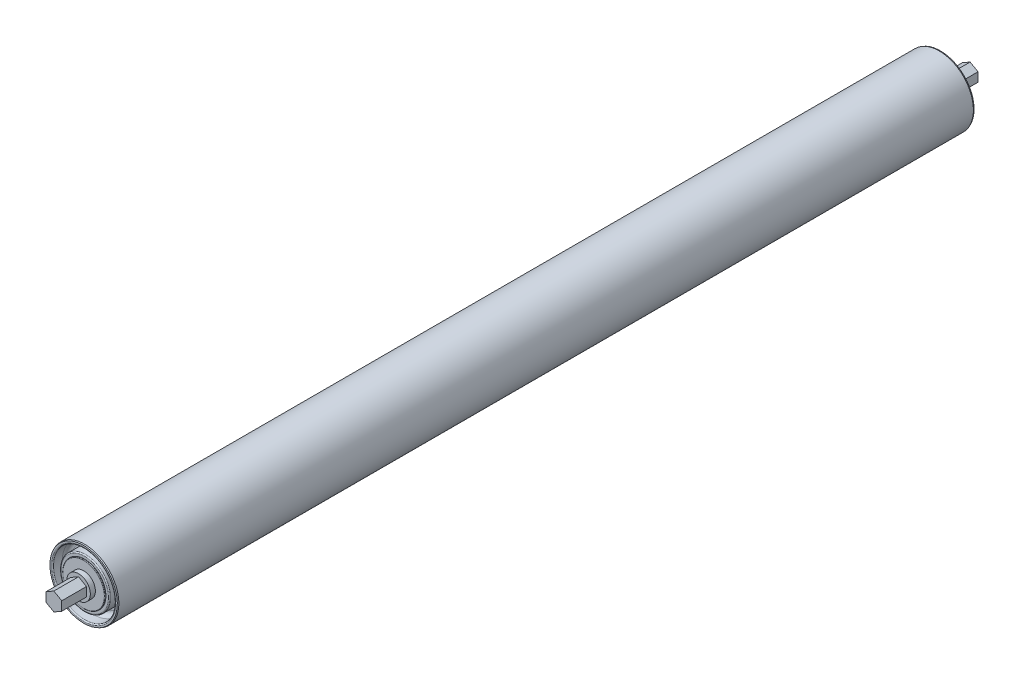
ISO-10303-21;
HEADER;
FILE_DESCRIPTION(('STEP AP214'),'2;1');
FILE_NAME('part.step','',(''),(''),'','','');
FILE_SCHEMA(('AUTOMOTIVE_DESIGN { 1 0 10303 214 1 1 1 1 }'));
ENDSEC;
DATA;
#1=APPLICATION_CONTEXT('core data for automotive mechanical design processes');
#2=APPLICATION_PROTOCOL_DEFINITION('international standard','automotive_design',2000,#1);
#3=PRODUCT_CONTEXT('',#1,'mechanical');
#4=PRODUCT('Part','Part','',(#3));
#5=PRODUCT_RELATED_PRODUCT_CATEGORY('part','',(#4));
#6=PRODUCT_DEFINITION_FORMATION('','',#4);
#7=PRODUCT_DEFINITION_CONTEXT('part definition',#1,'design');
#8=PRODUCT_DEFINITION('design','',#6,#7);
#9=PRODUCT_DEFINITION_SHAPE('','',#8);
#10=(LENGTH_UNIT() NAMED_UNIT(*) SI_UNIT(.MILLI.,.METRE.));
#11=(NAMED_UNIT(*) PLANE_ANGLE_UNIT() SI_UNIT($,.RADIAN.));
#12=(NAMED_UNIT(*) SI_UNIT($,.STERADIAN.) SOLID_ANGLE_UNIT());
#13=UNCERTAINTY_MEASURE_WITH_UNIT(LENGTH_MEASURE(1.E-05),#10,'distance_accuracy_value','');
#14=(GEOMETRIC_REPRESENTATION_CONTEXT(3) GLOBAL_UNCERTAINTY_ASSIGNED_CONTEXT((#13)) GLOBAL_UNIT_ASSIGNED_CONTEXT((#10,
#11,#12)) REPRESENTATION_CONTEXT('',''));
#15=CARTESIAN_POINT('',(0.,0.,0.));
#16=DIRECTION('',(0.,0.,1.));
#17=DIRECTION('',(1.,0.,0.));
#18=AXIS2_PLACEMENT_3D('',#15,#16,#17);
#19=CARTESIAN_POINT('',(0.,23.8125000000001,-302.815625));
#20=DIRECTION('',(0.,0.,1.));
#21=DIRECTION('',(0.,-1.,0.));
#22=AXIS2_PLACEMENT_3D('',#19,#20,#21);
#23=PLANE('',#22);
#24=CARTESIAN_POINT('',(0.,0.,-302.815625));
#25=DIRECTION('',(0.,0.,1.));
#26=DIRECTION('',(0.,-1.,0.));
#27=AXIS2_PLACEMENT_3D('',#24,#25,#26);
#28=CIRCLE('',#27,22.733);
#29=CARTESIAN_POINT('',(0.,-22.733,-302.815625));
#30=VERTEX_POINT('',#29);
#31=EDGE_CURVE('E299',#30,#30,#28,.T.);
#32=ORIENTED_EDGE('',*,*,#31,.T.);
#33=EDGE_LOOP('',(#32));
#34=FACE_BOUND('',#33,.T.);
#35=CARTESIAN_POINT('',(0.,0.,-302.815625));
#36=DIRECTION('',(0.,0.,1.));
#37=DIRECTION('',(0.,-1.,0.));
#38=AXIS2_PLACEMENT_3D('',#35,#36,#37);
#39=CIRCLE('',#38,23.8125);
#40=CARTESIAN_POINT('',(0.,-23.8124999999999,-302.815625));
#41=VERTEX_POINT('',#40);
#42=EDGE_CURVE('E217',#41,#41,#39,.T.);
#43=ORIENTED_EDGE('',*,*,#42,.F.);
#44=EDGE_LOOP('',(#43));
#45=FACE_BOUND('',#44,.T.);
#46=ADVANCED_FACE('F35',(#34,#45),#23,.F.);
#47=CARTESIAN_POINT('',(0.,0.,-302.815625));
#48=DIRECTION('',(0.,0.,1.));
#49=DIRECTION('',(0.,-1.,0.));
#50=AXIS2_PLACEMENT_3D('',#47,#48,#49);
#51=CONICAL_SURFACE('',#50,23.8125,0.380506377112347);
#52=CARTESIAN_POINT('',(0.,0.,-302.021875));
#53=DIRECTION('',(0.,0.,1.));
#54=DIRECTION('',(0.,-1.,0.));
#55=AXIS2_PLACEMENT_3D('',#52,#53,#54);
#56=CIRCLE('',#55,24.13);
#57=CARTESIAN_POINT('',(0.,-24.1299999999999,-302.021875));
#58=VERTEX_POINT('',#57);
#59=EDGE_CURVE('E214',#58,#58,#56,.T.);
#60=ORIENTED_EDGE('',*,*,#59,.F.);
#61=EDGE_LOOP('',(#60));
#62=FACE_BOUND('',#61,.T.);
#63=ORIENTED_EDGE('',*,*,#42,.T.);
#64=EDGE_LOOP('',(#63));
#65=FACE_BOUND('',#64,.T.);
#66=ADVANCED_FACE('F385',(#62,#65),#51,.T.);
#67=CARTESIAN_POINT('',(0.,0.,323.85));
#68=DIRECTION('',(0.,0.,1.));
#69=DIRECTION('',(0.,-1.,0.));
#70=AXIS2_PLACEMENT_3D('',#67,#68,#69);
#71=CYLINDRICAL_SURFACE('',#70,24.13);
#72=CARTESIAN_POINT('',(0.,0.,302.021875));
#73=DIRECTION('',(0.,0.,1.));
#74=DIRECTION('',(0.,-1.,0.));
#75=AXIS2_PLACEMENT_3D('',#72,#73,#74);
#76=CIRCLE('',#75,24.13);
#77=CARTESIAN_POINT('',(0.,-24.13,302.021875));
#78=VERTEX_POINT('',#77);
#79=EDGE_CURVE('E211',#78,#78,#76,.T.);
#80=ORIENTED_EDGE('',*,*,#79,.F.);
#81=EDGE_LOOP('',(#80));
#82=FACE_BOUND('',#81,.T.);
#83=ORIENTED_EDGE('',*,*,#59,.T.);
#84=EDGE_LOOP('',(#83));
#85=FACE_BOUND('',#84,.T.);
#86=ADVANCED_FACE('F390',(#82,#85),#71,.T.);
#87=CARTESIAN_POINT('',(0.,0.,302.021875));
#88=DIRECTION('',(0.,0.,-1.));
#89=DIRECTION('',(0.,1.,0.));
#90=AXIS2_PLACEMENT_3D('',#87,#88,#89);
#91=CONICAL_SURFACE('',#90,24.13,0.380506377112371);
#92=CARTESIAN_POINT('',(0.,0.,302.815625));
#93=DIRECTION('',(0.,0.,1.));
#94=DIRECTION('',(0.,-1.,0.));
#95=AXIS2_PLACEMENT_3D('',#92,#93,#94);
#96=CIRCLE('',#95,23.8125);
#97=CARTESIAN_POINT('',(0.,-23.8125,302.815625));
#98=VERTEX_POINT('',#97);
#99=EDGE_CURVE('E208',#98,#98,#96,.T.);
#100=ORIENTED_EDGE('',*,*,#99,.F.);
#101=EDGE_LOOP('',(#100));
#102=FACE_BOUND('',#101,.T.);
#103=ORIENTED_EDGE('',*,*,#79,.T.);
#104=EDGE_LOOP('',(#103));
#105=FACE_BOUND('',#104,.T.);
#106=ADVANCED_FACE('F469',(#102,#105),#91,.T.);
#107=CARTESIAN_POINT('',(0.,23.8125,302.815625));
#108=DIRECTION('',(0.,0.,-1.));
#109=DIRECTION('',(0.,1.,0.));
#110=AXIS2_PLACEMENT_3D('',#107,#108,#109);
#111=PLANE('',#110);
#112=CARTESIAN_POINT('',(0.,0.,302.815625));
#113=DIRECTION('',(0.,0.,1.));
#114=DIRECTION('',(0.,-1.,0.));
#115=AXIS2_PLACEMENT_3D('',#112,#113,#114);
#116=CIRCLE('',#115,22.733);
#117=CARTESIAN_POINT('',(0.,-22.733,302.815625));
#118=VERTEX_POINT('',#117);
#119=EDGE_CURVE('E134',#118,#118,#116,.T.);
#120=ORIENTED_EDGE('',*,*,#119,.F.);
#121=EDGE_LOOP('',(#120));
#122=FACE_BOUND('',#121,.T.);
#123=ORIENTED_EDGE('',*,*,#99,.T.);
#124=EDGE_LOOP('',(#123));
#125=FACE_BOUND('',#124,.T.);
#126=ADVANCED_FACE('F406',(#122,#125),#111,.F.);
#127=CARTESIAN_POINT('',(0.,0.,302.053625));
#128=DIRECTION('',(0.,0.,1.));
#129=DIRECTION('',(0.,-1.,0.));
#130=AXIS2_PLACEMENT_3D('',#127,#128,#129);
#131=TOROIDAL_SURFACE('',#130,22.733,0.76200000000003);
#132=ORIENTED_EDGE('',*,*,#119,.T.);
#133=EDGE_LOOP('',(#132));
#134=FACE_BOUND('',#133,.T.);
#135=CARTESIAN_POINT('',(0.,0.,302.053625));
#136=DIRECTION('',(0.,0.,1.));
#137=DIRECTION('',(0.,-1.,0.));
#138=AXIS2_PLACEMENT_3D('',#135,#136,#137);
#139=CIRCLE('',#138,21.971);
#140=CARTESIAN_POINT('',(0.,-21.971,302.053625));
#141=VERTEX_POINT('',#140);
#142=EDGE_CURVE('E296',#141,#141,#139,.T.);
#143=ORIENTED_EDGE('',*,*,#142,.F.);
#144=EDGE_LOOP('',(#143));
#145=FACE_BOUND('',#144,.T.);
#146=ADVANCED_FACE('F439',(#134,#145),#131,.T.);
#147=CARTESIAN_POINT('',(0.,0.,302.434625));
#148=DIRECTION('',(0.,0.,1.));
#149=DIRECTION('',(0.,-1.,0.));
#150=AXIS2_PLACEMENT_3D('',#147,#148,#149);
#151=TOROIDAL_SURFACE('',#150,14.620875,0.380999999999973);
#152=CARTESIAN_POINT('',(0.,0.,302.434625));
#153=DIRECTION('',(0.,0.,1.));
#154=DIRECTION('',(0.,-1.,0.));
#155=AXIS2_PLACEMENT_3D('',#152,#153,#154);
#156=CIRCLE('',#155,15.001875);
#157=CARTESIAN_POINT('',(0.,-15.001875,302.434625));
#158=VERTEX_POINT('',#157);
#159=EDGE_CURVE('E275',#158,#158,#156,.T.);
#160=ORIENTED_EDGE('',*,*,#159,.T.);
#161=EDGE_LOOP('',(#160));
#162=FACE_BOUND('',#161,.T.);
#163=CARTESIAN_POINT('',(0.,0.,302.815625));
#164=DIRECTION('',(0.,0.,1.));
#165=DIRECTION('',(0.,-1.,0.));
#166=AXIS2_PLACEMENT_3D('',#163,#164,#165);
#167=CIRCLE('',#166,14.620875);
#168=CARTESIAN_POINT('',(0.,-14.620875,302.815625));
#169=VERTEX_POINT('',#168);
#170=EDGE_CURVE('E272',#169,#169,#167,.T.);
#171=ORIENTED_EDGE('',*,*,#170,.F.);
#172=EDGE_LOOP('',(#171));
#173=FACE_BOUND('',#172,.T.);
#174=ADVANCED_FACE('F435',(#162,#173),#151,.T.);
#175=CARTESIAN_POINT('',(0.,0.,323.85));
#176=DIRECTION('',(0.,0.,1.));
#177=DIRECTION('',(0.,-1.,0.));
#178=AXIS2_PLACEMENT_3D('',#175,#176,#177);
#179=CYLINDRICAL_SURFACE('',#178,15.001875);
#180=CARTESIAN_POINT('',(0.,0.,302.053625));
#181=DIRECTION('',(0.,0.,1.));
#182=DIRECTION('',(0.,-1.,0.));
#183=AXIS2_PLACEMENT_3D('',#180,#181,#182);
#184=CIRCLE('',#183,15.001875);
#185=CARTESIAN_POINT('',(0.,-15.001875,302.053625));
#186=VERTEX_POINT('',#185);
#187=EDGE_CURVE('E278',#186,#186,#184,.T.);
#188=ORIENTED_EDGE('',*,*,#187,.T.);
#189=EDGE_LOOP('',(#188));
#190=FACE_BOUND('',#189,.T.);
#191=ORIENTED_EDGE('',*,*,#159,.F.);
#192=EDGE_LOOP('',(#191));
#193=FACE_BOUND('',#192,.T.);
#194=ADVANCED_FACE('F431',(#190,#193),#179,.T.);
#195=CARTESIAN_POINT('',(0.,15.001875,302.053625));
#196=DIRECTION('',(0.,0.,1.));
#197=DIRECTION('',(0.,-1.,0.));
#198=AXIS2_PLACEMENT_3D('',#195,#196,#197);
#199=PLANE('',#198);
#200=CARTESIAN_POINT('',(0.,0.,302.053625));
#201=DIRECTION('',(0.,0.,1.));
#202=DIRECTION('',(0.,-1.,0.));
#203=AXIS2_PLACEMENT_3D('',#200,#201,#202);
#204=CIRCLE('',#203,16.7401875);
#205=CARTESIAN_POINT('',(0.,-16.7401875,302.053625));
#206=VERTEX_POINT('',#205);
#207=EDGE_CURVE('E281',#206,#206,#204,.T.);
#208=ORIENTED_EDGE('',*,*,#207,.T.);
#209=EDGE_LOOP('',(#208));
#210=FACE_BOUND('',#209,.T.);
#211=ORIENTED_EDGE('',*,*,#187,.F.);
#212=EDGE_LOOP('',(#211));
#213=FACE_BOUND('',#212,.T.);
#214=ADVANCED_FACE('F427',(#210,#213),#199,.T.);
#215=CARTESIAN_POINT('',(0.,0.,301.291625));
#216=DIRECTION('',(0.,0.,1.));
#217=DIRECTION('',(0.,-1.,0.));
#218=AXIS2_PLACEMENT_3D('',#215,#216,#217);
#219=TOROIDAL_SURFACE('',#218,16.7401875,0.76199999999999);
#220=CARTESIAN_POINT('',(0.,0.,301.291625));
#221=DIRECTION('',(0.,0.,1.));
#222=DIRECTION('',(0.,-1.,0.));
#223=AXIS2_PLACEMENT_3D('',#220,#221,#222);
#224=CIRCLE('',#223,17.5021875);
#225=CARTESIAN_POINT('',(0.,-17.5021875,301.291625));
#226=VERTEX_POINT('',#225);
#227=EDGE_CURVE('E284',#226,#226,#224,.T.);
#228=ORIENTED_EDGE('',*,*,#227,.T.);
#229=EDGE_LOOP('',(#228));
#230=FACE_BOUND('',#229,.T.);
#231=ORIENTED_EDGE('',*,*,#207,.F.);
#232=EDGE_LOOP('',(#231));
#233=FACE_BOUND('',#232,.T.);
#234=ADVANCED_FACE('F423',(#230,#233),#219,.T.);
#235=CARTESIAN_POINT('',(0.,0.,323.85));
#236=DIRECTION('',(0.,0.,1.));
#237=DIRECTION('',(0.,-1.,0.));
#238=AXIS2_PLACEMENT_3D('',#235,#236,#237);
#239=CYLINDRICAL_SURFACE('',#238,17.5021875);
#240=CARTESIAN_POINT('',(0.,0.,292.89375));
#241=DIRECTION('',(0.,0.,1.));
#242=DIRECTION('',(0.,-1.,0.));
#243=AXIS2_PLACEMENT_3D('',#240,#241,#242);
#244=CIRCLE('',#243,17.5021875);
#245=CARTESIAN_POINT('',(0.,-17.5021875,292.89375));
#246=VERTEX_POINT('',#245);
#247=EDGE_CURVE('E287',#246,#246,#244,.T.);
#248=ORIENTED_EDGE('',*,*,#247,.T.);
#249=EDGE_LOOP('',(#248));
#250=FACE_BOUND('',#249,.T.);
#251=ORIENTED_EDGE('',*,*,#227,.F.);
#252=EDGE_LOOP('',(#251));
#253=FACE_BOUND('',#252,.T.);
#254=ADVANCED_FACE('F419',(#250,#253),#239,.T.);
#255=CARTESIAN_POINT('',(0.,17.5021875,292.89375));
#256=DIRECTION('',(0.,0.,1.));
#257=DIRECTION('',(0.,-1.,0.));
#258=AXIS2_PLACEMENT_3D('',#255,#256,#257);
#259=PLANE('',#258);
#260=CARTESIAN_POINT('',(0.,0.,292.89375));
#261=DIRECTION('',(0.,0.,1.));
#262=DIRECTION('',(0.,-1.,0.));
#263=AXIS2_PLACEMENT_3D('',#260,#261,#262);
#264=CIRCLE('',#263,18.923);
#265=CARTESIAN_POINT('',(0.,-18.923,292.89375));
#266=VERTEX_POINT('',#265);
#267=EDGE_CURVE('E290',#266,#266,#264,.T.);
#268=ORIENTED_EDGE('',*,*,#267,.T.);
#269=EDGE_LOOP('',(#268));
#270=FACE_BOUND('',#269,.T.);
#271=ORIENTED_EDGE('',*,*,#247,.F.);
#272=EDGE_LOOP('',(#271));
#273=FACE_BOUND('',#272,.T.);
#274=ADVANCED_FACE('F415',(#270,#273),#259,.T.);
#275=CARTESIAN_POINT('',(0.,0.,295.94175));
#276=DIRECTION('',(0.,0.,1.));
#277=DIRECTION('',(0.,-1.,0.));
#278=AXIS2_PLACEMENT_3D('',#275,#276,#277);
#279=TOROIDAL_SURFACE('',#278,18.923,3.048);
#280=CARTESIAN_POINT('',(0.,0.,295.94175));
#281=DIRECTION('',(0.,0.,1.));
#282=DIRECTION('',(0.,-1.,0.));
#283=AXIS2_PLACEMENT_3D('',#280,#281,#282);
#284=CIRCLE('',#283,21.971);
#285=CARTESIAN_POINT('',(0.,-21.971,295.94175));
#286=VERTEX_POINT('',#285);
#287=EDGE_CURVE('E293',#286,#286,#284,.T.);
#288=ORIENTED_EDGE('',*,*,#287,.T.);
#289=EDGE_LOOP('',(#288));
#290=FACE_BOUND('',#289,.T.);
#291=ORIENTED_EDGE('',*,*,#267,.F.);
#292=EDGE_LOOP('',(#291));
#293=FACE_BOUND('',#292,.T.);
#294=ADVANCED_FACE('F411',(#290,#293),#279,.F.);
#295=CARTESIAN_POINT('',(0.,0.,323.85));
#296=DIRECTION('',(0.,0.,1.));
#297=DIRECTION('',(0.,-1.,0.));
#298=AXIS2_PLACEMENT_3D('',#295,#296,#297);
#299=CYLINDRICAL_SURFACE('',#298,21.971);
#300=ORIENTED_EDGE('',*,*,#142,.T.);
#301=EDGE_LOOP('',(#300));
#302=FACE_BOUND('',#301,.T.);
#303=ORIENTED_EDGE('',*,*,#287,.F.);
#304=EDGE_LOOP('',(#303));
#305=FACE_BOUND('',#304,.T.);
#306=ADVANCED_FACE('F408',(#302,#305),#299,.F.);
#307=CARTESIAN_POINT('',(0.,0.,323.85));
#308=DIRECTION('',(0.,0.,-1.));
#309=DIRECTION('',(0.,1.,0.));
#310=AXIS2_PLACEMENT_3D('',#307,#308,#309);
#311=PLANE('',#310);
#312=DIRECTION('',(0.866025403784439,0.5,0.));
#313=VECTOR('',#312,1.);
#314=CARTESIAN_POINT('',(0.,-6.41580486636976,323.85));
#315=LINE('',#314,#313);
#316=CARTESIAN_POINT('',(0.,-6.41580486636976,323.85));
#317=VERTEX_POINT('',#316);
#318=CARTESIAN_POINT('',(5.55625,-3.2079024331849,323.85));
#319=VERTEX_POINT('',#318);
#320=EDGE_CURVE('E154',#317,#319,#315,.T.);
#321=ORIENTED_EDGE('',*,*,#320,.T.);
#322=DIRECTION('',(0.,1.,0.));
#323=VECTOR('',#322,1.);
#324=CARTESIAN_POINT('',(5.55625,-3.2079024331849,323.85));
#325=LINE('',#324,#323);
#326=CARTESIAN_POINT('',(5.55625,3.20790243318482,323.85));
#327=VERTEX_POINT('',#326);
#328=EDGE_CURVE('E130',#319,#327,#325,.T.);
#329=ORIENTED_EDGE('',*,*,#328,.T.);
#330=DIRECTION('',(-0.866025403784439,0.5,0.));
#331=VECTOR('',#330,1.);
#332=CARTESIAN_POINT('',(5.55625,3.20790243318482,323.85));
#333=LINE('',#332,#331);
#334=CARTESIAN_POINT('',(0.,6.41580486636967,323.85));
#335=VERTEX_POINT('',#334);
#336=EDGE_CURVE('E123',#327,#335,#333,.T.);
#337=ORIENTED_EDGE('',*,*,#336,.T.);
#338=DIRECTION('',(-0.866025403784439,-0.5,0.));
#339=VECTOR('',#338,1.);
#340=CARTESIAN_POINT('',(0.,6.41580486636967,323.85));
#341=LINE('',#340,#339);
#342=CARTESIAN_POINT('',(-5.55625,3.20790243318482,323.85));
#343=VERTEX_POINT('',#342);
#344=EDGE_CURVE('E127',#335,#343,#341,.T.);
#345=ORIENTED_EDGE('',*,*,#344,.T.);
#346=DIRECTION('',(0.,-1.,0.));
#347=VECTOR('',#346,1.);
#348=CARTESIAN_POINT('',(-5.55625,3.20790243318482,323.85));
#349=LINE('',#348,#347);
#350=CARTESIAN_POINT('',(-5.55625,-3.2079024331849,323.85));
#351=VERTEX_POINT('',#350);
#352=EDGE_CURVE('E147',#343,#351,#349,.T.);
#353=ORIENTED_EDGE('',*,*,#352,.T.);
#354=DIRECTION('',(0.866025403784439,-0.5,0.));
#355=VECTOR('',#354,1.);
#356=CARTESIAN_POINT('',(-5.55625,-3.2079024331849,323.85));
#357=LINE('',#356,#355);
#358=EDGE_CURVE('E149',#351,#317,#357,.T.);
#359=ORIENTED_EDGE('',*,*,#358,.T.);
#360=EDGE_LOOP('',(#321,#329,#337,#345,#353,#359));
#361=FACE_BOUND('',#360,.T.);
#362=ADVANCED_FACE('F125',(#361),#311,.F.);
#363=CARTESIAN_POINT('',(-5.55625,3.20790243318482,-340.824624136732));
#364=DIRECTION('',(-1.,0.,0.));
#365=DIRECTION('',(0.,-1.,0.));
#366=AXIS2_PLACEMENT_3D('',#363,#364,#365);
#367=PLANE('',#366);
#368=DIRECTION('',(0.,1.,0.));
#369=VECTOR('',#368,1.);
#370=CARTESIAN_POINT('',(-5.55625,8.334375,306.3875));
#371=LINE('',#370,#369);
#372=CARTESIAN_POINT('',(-5.55625,-3.2079024331849,306.3875));
#373=VERTEX_POINT('',#372);
#374=CARTESIAN_POINT('',(-5.55625,3.20790243318482,306.3875));
#375=VERTEX_POINT('',#374);
#376=EDGE_CURVE('E183',#373,#375,#371,.T.);
#377=ORIENTED_EDGE('',*,*,#376,.F.);
#378=DIRECTION('',(0.,0.,1.));
#379=VECTOR('',#378,1.);
#380=CARTESIAN_POINT('',(-5.55625,-3.2079024331849,-340.824624136732));
#381=LINE('',#380,#379);
#382=EDGE_CURVE('E173',#373,#351,#381,.T.);
#383=ORIENTED_EDGE('',*,*,#382,.T.);
#384=ORIENTED_EDGE('',*,*,#352,.F.);
#385=DIRECTION('',(0.,0.,1.));
#386=VECTOR('',#385,1.);
#387=CARTESIAN_POINT('',(-5.55625,3.20790243318482,-340.824624136732));
#388=LINE('',#387,#386);
#389=EDGE_CURVE('E145',#375,#343,#388,.T.);
#390=ORIENTED_EDGE('',*,*,#389,.F.);
#391=EDGE_LOOP('',(#377,#383,#384,#390));
#392=FACE_BOUND('',#391,.T.);
#393=ADVANCED_FACE('F455',(#392),#367,.T.);
#394=CARTESIAN_POINT('',(-5.55625,-3.2079024331849,-340.824624136732));
#395=DIRECTION('',(-0.5,-0.866025403784439,0.));
#396=DIRECTION('',(0.866025403784439,-0.5,0.));
#397=AXIS2_PLACEMENT_3D('',#394,#395,#396);
#398=PLANE('',#397);
#399=DIRECTION('',(-0.866025403784439,0.5,0.));
#400=VECTOR('',#399,1.);
#401=CARTESIAN_POINT('',(-6.38701523733298,-2.72825989977732,306.3875));
#402=LINE('',#401,#400);
#403=CARTESIAN_POINT('',(0.,-6.41580486636976,306.3875));
#404=VERTEX_POINT('',#403);
#405=EDGE_CURVE('E187',#404,#373,#402,.T.);
#406=ORIENTED_EDGE('',*,*,#405,.F.);
#407=DIRECTION('',(0.,0.,1.));
#408=VECTOR('',#407,1.);
#409=CARTESIAN_POINT('',(0.,-6.41580486636976,-340.824624136732));
#410=LINE('',#409,#408);
#411=EDGE_CURVE('E169',#404,#317,#410,.T.);
#412=ORIENTED_EDGE('',*,*,#411,.T.);
#413=ORIENTED_EDGE('',*,*,#358,.F.);
#414=ORIENTED_EDGE('',*,*,#382,.F.);
#415=EDGE_LOOP('',(#406,#412,#413,#414));
#416=FACE_BOUND('',#415,.T.);
#417=ADVANCED_FACE('F452',(#416),#398,.T.);
#418=CARTESIAN_POINT('',(0.,-6.41580486636976,-340.824624136732));
#419=DIRECTION('',(0.5,-0.866025403784439,0.));
#420=DIRECTION('',(0.866025403784439,0.5,0.));
#421=AXIS2_PLACEMENT_3D('',#418,#419,#420);
#422=PLANE('',#421);
#423=DIRECTION('',(-0.866025403784439,-0.5,0.));
#424=VECTOR('',#423,1.);
#425=CARTESIAN_POINT('',(6.38701523733298,-2.72825989977732,306.3875));
#426=LINE('',#425,#424);
#427=CARTESIAN_POINT('',(5.55625,-3.2079024331849,306.3875));
#428=VERTEX_POINT('',#427);
#429=EDGE_CURVE('E191',#428,#404,#426,.T.);
#430=ORIENTED_EDGE('',*,*,#429,.F.);
#431=DIRECTION('',(0.,0.,1.));
#432=VECTOR('',#431,1.);
#433=CARTESIAN_POINT('',(5.55625,-3.2079024331849,-340.824624136732));
#434=LINE('',#433,#432);
#435=EDGE_CURVE('E165',#428,#319,#434,.T.);
#436=ORIENTED_EDGE('',*,*,#435,.T.);
#437=ORIENTED_EDGE('',*,*,#320,.F.);
#438=ORIENTED_EDGE('',*,*,#411,.F.);
#439=EDGE_LOOP('',(#430,#436,#437,#438));
#440=FACE_BOUND('',#439,.T.);
#441=ADVANCED_FACE('F449',(#440),#422,.T.);
#442=CARTESIAN_POINT('',(5.55625,-3.2079024331849,-340.824624136732));
#443=DIRECTION('',(1.,0.,0.));
#444=DIRECTION('',(0.,1.,0.));
#445=AXIS2_PLACEMENT_3D('',#442,#443,#444);
#446=PLANE('',#445);
#447=DIRECTION('',(0.,-1.,0.));
#448=VECTOR('',#447,1.);
#449=CARTESIAN_POINT('',(5.55624999999999,8.334375,306.3875));
#450=LINE('',#449,#448);
#451=CARTESIAN_POINT('',(5.55625,3.20790243318482,306.3875));
#452=VERTEX_POINT('',#451);
#453=EDGE_CURVE('E195',#452,#428,#450,.T.);
#454=ORIENTED_EDGE('',*,*,#453,.F.);
#455=DIRECTION('',(0.,0.,1.));
#456=VECTOR('',#455,1.);
#457=CARTESIAN_POINT('',(5.55625,3.20790243318482,-340.824624136732));
#458=LINE('',#457,#456);
#459=EDGE_CURVE('E161',#452,#327,#458,.T.);
#460=ORIENTED_EDGE('',*,*,#459,.T.);
#461=ORIENTED_EDGE('',*,*,#328,.F.);
#462=ORIENTED_EDGE('',*,*,#435,.F.);
#463=EDGE_LOOP('',(#454,#460,#461,#462));
#464=FACE_BOUND('',#463,.T.);
#465=ADVANCED_FACE('F446',(#464),#446,.T.);
#466=CARTESIAN_POINT('',(5.55625,3.20790243318482,-340.824624136732));
#467=DIRECTION('',(0.5,0.866025403784439,0.));
#468=DIRECTION('',(-0.866025403784439,0.5,0.));
#469=AXIS2_PLACEMENT_3D('',#466,#467,#468);
#470=PLANE('',#469);
#471=DIRECTION('',(0.866025403784439,-0.5,0.));
#472=VECTOR('',#471,1.);
#473=CARTESIAN_POINT('',(-0.830765237332983,6.89544739977726,306.3875));
#474=LINE('',#473,#472);
#475=CARTESIAN_POINT('',(0.,6.41580486636967,306.3875));
#476=VERTEX_POINT('',#475);
#477=EDGE_CURVE('E139',#476,#452,#474,.T.);
#478=ORIENTED_EDGE('',*,*,#477,.F.);
#479=DIRECTION('',(0.,0.,1.));
#480=VECTOR('',#479,1.);
#481=CARTESIAN_POINT('',(0.,6.41580486636967,-340.824624136732));
#482=LINE('',#481,#480);
#483=EDGE_CURVE('E137',#476,#335,#482,.T.);
#484=ORIENTED_EDGE('',*,*,#483,.T.);
#485=ORIENTED_EDGE('',*,*,#336,.F.);
#486=ORIENTED_EDGE('',*,*,#459,.F.);
#487=EDGE_LOOP('',(#478,#484,#485,#486));
#488=FACE_BOUND('',#487,.T.);
#489=ADVANCED_FACE('F138',(#488),#470,.T.);
#490=CARTESIAN_POINT('',(0.,6.41580486636967,-340.824624136732));
#491=DIRECTION('',(-0.5,0.866025403784439,0.));
#492=DIRECTION('',(-0.866025403784439,-0.5,0.));
#493=AXIS2_PLACEMENT_3D('',#490,#491,#492);
#494=PLANE('',#493);
#495=DIRECTION('',(0.866025403784439,0.5,0.));
#496=VECTOR('',#495,1.);
#497=CARTESIAN_POINT('',(0.830765237332983,6.89544739977726,306.3875));
#498=LINE('',#497,#496);
#499=EDGE_CURVE('E58',#375,#476,#498,.T.);
#500=ORIENTED_EDGE('',*,*,#499,.F.);
#501=ORIENTED_EDGE('',*,*,#389,.T.);
#502=ORIENTED_EDGE('',*,*,#344,.F.);
#503=ORIENTED_EDGE('',*,*,#483,.F.);
#504=EDGE_LOOP('',(#500,#501,#502,#503));
#505=FACE_BOUND('',#504,.T.);
#506=ADVANCED_FACE('F143',(#505),#494,.T.);
#507=CARTESIAN_POINT('',(0.,8.334375,306.3875));
#508=DIRECTION('',(0.,0.,-1.));
#509=DIRECTION('',(0.,1.,0.));
#510=AXIS2_PLACEMENT_3D('',#507,#508,#509);
#511=PLANE('',#510);
#512=ORIENTED_EDGE('',*,*,#499,.T.);
#513=ORIENTED_EDGE('',*,*,#477,.T.);
#514=ORIENTED_EDGE('',*,*,#453,.T.);
#515=ORIENTED_EDGE('',*,*,#429,.T.);
#516=ORIENTED_EDGE('',*,*,#405,.T.);
#517=ORIENTED_EDGE('',*,*,#376,.T.);
#518=EDGE_LOOP('',(#512,#513,#514,#515,#516,#517));
#519=FACE_BOUND('',#518,.T.);
#520=CARTESIAN_POINT('',(0.,0.,306.3875));
#521=DIRECTION('',(0.,0.,1.));
#522=DIRECTION('',(0.,-1.,0.));
#523=AXIS2_PLACEMENT_3D('',#520,#521,#522);
#524=CIRCLE('',#523,8.334375);
#525=CARTESIAN_POINT('',(0.,-8.334375,306.3875));
#526=VERTEX_POINT('',#525);
#527=EDGE_CURVE('E202',#526,#526,#524,.T.);
#528=ORIENTED_EDGE('',*,*,#527,.T.);
#529=EDGE_LOOP('',(#528));
#530=FACE_BOUND('',#529,.T.);
#531=ADVANCED_FACE('F462',(#519,#530),#511,.F.);
#532=CARTESIAN_POINT('',(0.,0.,323.85));
#533=DIRECTION('',(0.,0.,1.));
#534=DIRECTION('',(0.,-1.,0.));
#535=AXIS2_PLACEMENT_3D('',#532,#533,#534);
#536=CYLINDRICAL_SURFACE('',#535,8.334375);
#537=ORIENTED_EDGE('',*,*,#527,.F.);
#538=EDGE_LOOP('',(#537));
#539=FACE_BOUND('',#538,.T.);
#540=CARTESIAN_POINT('',(0.,0.,302.815625));
#541=DIRECTION('',(0.,0.,1.));
#542=DIRECTION('',(0.,-1.,0.));
#543=AXIS2_PLACEMENT_3D('',#540,#541,#542);
#544=CIRCLE('',#543,8.334375);
#545=CARTESIAN_POINT('',(0.,-8.334375,302.815625));
#546=VERTEX_POINT('',#545);
#547=EDGE_CURVE('E205',#546,#546,#544,.T.);
#548=ORIENTED_EDGE('',*,*,#547,.T.);
#549=EDGE_LOOP('',(#548));
#550=FACE_BOUND('',#549,.T.);
#551=ADVANCED_FACE('F403',(#539,#550),#536,.T.);
#552=ORIENTED_EDGE('',*,*,#547,.F.);
#553=EDGE_LOOP('',(#552));
#554=FACE_BOUND('',#553,.T.);
#555=ORIENTED_EDGE('',*,*,#170,.T.);
#556=EDGE_LOOP('',(#555));
#557=FACE_BOUND('',#556,.T.);
#558=ADVANCED_FACE('F398',(#554,#557),#111,.F.);
#559=CARTESIAN_POINT('',(0.,0.,-302.053625));
#560=DIRECTION('',(0.,0.,-1.));
#561=DIRECTION('',(0.,-1.,0.));
#562=AXIS2_PLACEMENT_3D('',#559,#560,#561);
#563=TOROIDAL_SURFACE('',#562,22.733,0.76200000000003);
#564=ORIENTED_EDGE('',*,*,#31,.F.);
#565=EDGE_LOOP('',(#564));
#566=FACE_BOUND('',#565,.T.);
#567=CARTESIAN_POINT('',(0.,0.,-302.053625));
#568=DIRECTION('',(0.,0.,1.));
#569=DIRECTION('',(0.,-1.,0.));
#570=AXIS2_PLACEMENT_3D('',#567,#568,#569);
#571=CIRCLE('',#570,21.971);
#572=CARTESIAN_POINT('',(0.,-21.971,-302.053625));
#573=VERTEX_POINT('',#572);
#574=EDGE_CURVE('E326',#573,#573,#571,.T.);
#575=ORIENTED_EDGE('',*,*,#574,.T.);
#576=EDGE_LOOP('',(#575));
#577=FACE_BOUND('',#576,.T.);
#578=ADVANCED_FACE('F330',(#566,#577),#563,.T.);
#579=CARTESIAN_POINT('',(0.,0.,-302.434625));
#580=DIRECTION('',(0.,0.,-1.));
#581=DIRECTION('',(0.,-1.,0.));
#582=AXIS2_PLACEMENT_3D('',#579,#580,#581);
#583=TOROIDAL_SURFACE('',#582,14.620875,0.380999999999973);
#584=CARTESIAN_POINT('',(0.,0.,-302.434625));
#585=DIRECTION('',(0.,0.,1.));
#586=DIRECTION('',(0.,-1.,0.));
#587=AXIS2_PLACEMENT_3D('',#584,#585,#586);
#588=CIRCLE('',#587,15.001875);
#589=CARTESIAN_POINT('',(0.,-15.001875,-302.434625));
#590=VERTEX_POINT('',#589);
#591=EDGE_CURVE('E305',#590,#590,#588,.T.);
#592=ORIENTED_EDGE('',*,*,#591,.F.);
#593=EDGE_LOOP('',(#592));
#594=FACE_BOUND('',#593,.T.);
#595=CARTESIAN_POINT('',(0.,0.,-302.815625));
#596=DIRECTION('',(0.,0.,1.));
#597=DIRECTION('',(0.,-1.,0.));
#598=AXIS2_PLACEMENT_3D('',#595,#596,#597);
#599=CIRCLE('',#598,14.620875);
#600=CARTESIAN_POINT('',(0.,-14.620875,-302.815625));
#601=VERTEX_POINT('',#600);
#602=EDGE_CURVE('E302',#601,#601,#599,.T.);
#603=ORIENTED_EDGE('',*,*,#602,.T.);
#604=EDGE_LOOP('',(#603));
#605=FACE_BOUND('',#604,.T.);
#606=ADVANCED_FACE('F371',(#594,#605),#583,.T.);
#607=CARTESIAN_POINT('',(0.,0.,-323.85));
#608=DIRECTION('',(0.,0.,-1.));
#609=DIRECTION('',(0.,-1.,0.));
#610=AXIS2_PLACEMENT_3D('',#607,#608,#609);
#611=CYLINDRICAL_SURFACE('',#610,15.001875);
#612=CARTESIAN_POINT('',(0.,0.,-302.053625));
#613=DIRECTION('',(0.,0.,1.));
#614=DIRECTION('',(0.,-1.,0.));
#615=AXIS2_PLACEMENT_3D('',#612,#613,#614);
#616=CIRCLE('',#615,15.001875);
#617=CARTESIAN_POINT('',(0.,-15.001875,-302.053625));
#618=VERTEX_POINT('',#617);
#619=EDGE_CURVE('E308',#618,#618,#616,.T.);
#620=ORIENTED_EDGE('',*,*,#619,.F.);
#621=EDGE_LOOP('',(#620));
#622=FACE_BOUND('',#621,.T.);
#623=ORIENTED_EDGE('',*,*,#591,.T.);
#624=EDGE_LOOP('',(#623));
#625=FACE_BOUND('',#624,.T.);
#626=ADVANCED_FACE('F365',(#622,#625),#611,.T.);
#627=CARTESIAN_POINT('',(0.,15.001875,-302.053625));
#628=DIRECTION('',(0.,0.,-1.));
#629=DIRECTION('',(0.,-1.,0.));
#630=AXIS2_PLACEMENT_3D('',#627,#628,#629);
#631=PLANE('',#630);
#632=CARTESIAN_POINT('',(0.,0.,-302.053625));
#633=DIRECTION('',(0.,0.,1.));
#634=DIRECTION('',(0.,-1.,0.));
#635=AXIS2_PLACEMENT_3D('',#632,#633,#634);
#636=CIRCLE('',#635,16.7401875);
#637=CARTESIAN_POINT('',(0.,-16.7401875,-302.053625));
#638=VERTEX_POINT('',#637);
#639=EDGE_CURVE('E311',#638,#638,#636,.T.);
#640=ORIENTED_EDGE('',*,*,#639,.F.);
#641=EDGE_LOOP('',(#640));
#642=FACE_BOUND('',#641,.T.);
#643=ORIENTED_EDGE('',*,*,#619,.T.);
#644=EDGE_LOOP('',(#643));
#645=FACE_BOUND('',#644,.T.);
#646=ADVANCED_FACE('F359',(#642,#645),#631,.T.);
#647=CARTESIAN_POINT('',(0.,0.,-301.291625));
#648=DIRECTION('',(0.,0.,-1.));
#649=DIRECTION('',(0.,-1.,0.));
#650=AXIS2_PLACEMENT_3D('',#647,#648,#649);
#651=TOROIDAL_SURFACE('',#650,16.7401875,0.76199999999999);
#652=CARTESIAN_POINT('',(0.,0.,-301.291625));
#653=DIRECTION('',(0.,0.,1.));
#654=DIRECTION('',(0.,-1.,0.));
#655=AXIS2_PLACEMENT_3D('',#652,#653,#654);
#656=CIRCLE('',#655,17.5021875);
#657=CARTESIAN_POINT('',(0.,-17.5021875,-301.291625));
#658=VERTEX_POINT('',#657);
#659=EDGE_CURVE('E314',#658,#658,#656,.T.);
#660=ORIENTED_EDGE('',*,*,#659,.F.);
#661=EDGE_LOOP('',(#660));
#662=FACE_BOUND('',#661,.T.);
#663=ORIENTED_EDGE('',*,*,#639,.T.);
#664=EDGE_LOOP('',(#663));
#665=FACE_BOUND('',#664,.T.);
#666=ADVANCED_FACE('F353',(#662,#665),#651,.T.);
#667=CARTESIAN_POINT('',(0.,0.,-323.85));
#668=DIRECTION('',(0.,0.,-1.));
#669=DIRECTION('',(0.,-1.,0.));
#670=AXIS2_PLACEMENT_3D('',#667,#668,#669);
#671=CYLINDRICAL_SURFACE('',#670,17.5021875);
#672=CARTESIAN_POINT('',(0.,0.,-292.89375));
#673=DIRECTION('',(0.,0.,1.));
#674=DIRECTION('',(0.,-1.,0.));
#675=AXIS2_PLACEMENT_3D('',#672,#673,#674);
#676=CIRCLE('',#675,17.5021875);
#677=CARTESIAN_POINT('',(0.,-17.5021875,-292.89375));
#678=VERTEX_POINT('',#677);
#679=EDGE_CURVE('E317',#678,#678,#676,.T.);
#680=ORIENTED_EDGE('',*,*,#679,.F.);
#681=EDGE_LOOP('',(#680));
#682=FACE_BOUND('',#681,.T.);
#683=ORIENTED_EDGE('',*,*,#659,.T.);
#684=EDGE_LOOP('',(#683));
#685=FACE_BOUND('',#684,.T.);
#686=ADVANCED_FACE('F347',(#682,#685),#671,.T.);
#687=CARTESIAN_POINT('',(0.,17.5021875,-292.89375));
#688=DIRECTION('',(0.,0.,-1.));
#689=DIRECTION('',(0.,-1.,0.));
#690=AXIS2_PLACEMENT_3D('',#687,#688,#689);
#691=PLANE('',#690);
#692=CARTESIAN_POINT('',(0.,0.,-292.89375));
#693=DIRECTION('',(0.,0.,1.));
#694=DIRECTION('',(0.,-1.,0.));
#695=AXIS2_PLACEMENT_3D('',#692,#693,#694);
#696=CIRCLE('',#695,18.923);
#697=CARTESIAN_POINT('',(0.,-18.923,-292.89375));
#698=VERTEX_POINT('',#697);
#699=EDGE_CURVE('E320',#698,#698,#696,.T.);
#700=ORIENTED_EDGE('',*,*,#699,.F.);
#701=EDGE_LOOP('',(#700));
#702=FACE_BOUND('',#701,.T.);
#703=ORIENTED_EDGE('',*,*,#679,.T.);
#704=EDGE_LOOP('',(#703));
#705=FACE_BOUND('',#704,.T.);
#706=ADVANCED_FACE('F341',(#702,#705),#691,.T.);
#707=CARTESIAN_POINT('',(0.,0.,-295.94175));
#708=DIRECTION('',(0.,0.,-1.));
#709=DIRECTION('',(0.,-1.,0.));
#710=AXIS2_PLACEMENT_3D('',#707,#708,#709);
#711=TOROIDAL_SURFACE('',#710,18.923,3.048);
#712=CARTESIAN_POINT('',(0.,0.,-295.94175));
#713=DIRECTION('',(0.,0.,1.));
#714=DIRECTION('',(0.,-1.,0.));
#715=AXIS2_PLACEMENT_3D('',#712,#713,#714);
#716=CIRCLE('',#715,21.971);
#717=CARTESIAN_POINT('',(0.,-21.971,-295.94175));
#718=VERTEX_POINT('',#717);
#719=EDGE_CURVE('E323',#718,#718,#716,.T.);
#720=ORIENTED_EDGE('',*,*,#719,.F.);
#721=EDGE_LOOP('',(#720));
#722=FACE_BOUND('',#721,.T.);
#723=ORIENTED_EDGE('',*,*,#699,.T.);
#724=EDGE_LOOP('',(#723));
#725=FACE_BOUND('',#724,.T.);
#726=ADVANCED_FACE('F335',(#722,#725),#711,.F.);
#727=CARTESIAN_POINT('',(0.,0.,-323.85));
#728=DIRECTION('',(0.,0.,-1.));
#729=DIRECTION('',(0.,-1.,0.));
#730=AXIS2_PLACEMENT_3D('',#727,#728,#729);
#731=CYLINDRICAL_SURFACE('',#730,21.971);
#732=ORIENTED_EDGE('',*,*,#574,.F.);
#733=EDGE_LOOP('',(#732));
#734=FACE_BOUND('',#733,.T.);
#735=ORIENTED_EDGE('',*,*,#719,.T.);
#736=EDGE_LOOP('',(#735));
#737=FACE_BOUND('',#736,.T.);
#738=ADVANCED_FACE('F332',(#734,#737),#731,.F.);
#739=CARTESIAN_POINT('',(0.,0.,-323.85));
#740=DIRECTION('',(0.,0.,1.));
#741=DIRECTION('',(0.,-1.,0.));
#742=AXIS2_PLACEMENT_3D('',#739,#740,#741);
#743=PLANE('',#742);
#744=DIRECTION('',(0.866025403784439,-0.5,0.));
#745=VECTOR('',#744,1.);
#746=CARTESIAN_POINT('',(5.55625,3.20790243318482,-323.85));
#747=LINE('',#746,#745);
#748=CARTESIAN_POINT('',(0.,6.41580486636967,-323.85));
#749=VERTEX_POINT('',#748);
#750=CARTESIAN_POINT('',(5.55625,3.20790243318482,-323.85));
#751=VERTEX_POINT('',#750);
#752=EDGE_CURVE('E180',#749,#751,#747,.T.);
#753=ORIENTED_EDGE('',*,*,#752,.T.);
#754=DIRECTION('',(0.,-1.,0.));
#755=VECTOR('',#754,1.);
#756=CARTESIAN_POINT('',(5.55625,-3.2079024331849,-323.85));
#757=LINE('',#756,#755);
#758=CARTESIAN_POINT('',(5.55625,-3.2079024331849,-323.85));
#759=VERTEX_POINT('',#758);
#760=EDGE_CURVE('E253',#751,#759,#757,.T.);
#761=ORIENTED_EDGE('',*,*,#760,.T.);
#762=DIRECTION('',(-0.866025403784439,-0.5,0.));
#763=VECTOR('',#762,1.);
#764=CARTESIAN_POINT('',(0.,-6.41580486636976,-323.85));
#765=LINE('',#764,#763);
#766=CARTESIAN_POINT('',(0.,-6.41580486636976,-323.85));
#767=VERTEX_POINT('',#766);
#768=EDGE_CURVE('E250',#759,#767,#765,.T.);
#769=ORIENTED_EDGE('',*,*,#768,.T.);
#770=DIRECTION('',(-0.866025403784439,0.5,0.));
#771=VECTOR('',#770,1.);
#772=CARTESIAN_POINT('',(-5.55625,-3.2079024331849,-323.85));
#773=LINE('',#772,#771);
#774=CARTESIAN_POINT('',(-5.55625,-3.2079024331849,-323.85));
#775=VERTEX_POINT('',#774);
#776=EDGE_CURVE('E246',#767,#775,#773,.T.);
#777=ORIENTED_EDGE('',*,*,#776,.T.);
#778=DIRECTION('',(0.,1.,0.));
#779=VECTOR('',#778,1.);
#780=CARTESIAN_POINT('',(-5.55625,3.20790243318482,-323.85));
#781=LINE('',#780,#779);
#782=CARTESIAN_POINT('',(-5.55625,3.20790243318482,-323.85));
#783=VERTEX_POINT('',#782);
#784=EDGE_CURVE('E160',#775,#783,#781,.T.);
#785=ORIENTED_EDGE('',*,*,#784,.T.);
#786=DIRECTION('',(0.866025403784439,0.5,0.));
#787=VECTOR('',#786,1.);
#788=CARTESIAN_POINT('',(0.,6.41580486636967,-323.85));
#789=LINE('',#788,#787);
#790=EDGE_CURVE('E177',#783,#749,#789,.T.);
#791=ORIENTED_EDGE('',*,*,#790,.T.);
#792=EDGE_LOOP('',(#753,#761,#769,#777,#785,#791));
#793=FACE_BOUND('',#792,.T.);
#794=ADVANCED_FACE('F37',(#793),#743,.F.);
#795=CARTESIAN_POINT('',(-5.55625,-3.2079024331849,-306.3875));
#796=VERTEX_POINT('',#795);
#797=EDGE_CURVE('E170',#775,#796,#381,.T.);
#798=ORIENTED_EDGE('',*,*,#797,.T.);
#799=DIRECTION('',(0.,-1.,0.));
#800=VECTOR('',#799,1.);
#801=CARTESIAN_POINT('',(-5.55625,8.33437500000007,-306.3875));
#802=LINE('',#801,#800);
#803=CARTESIAN_POINT('',(-5.55625,3.20790243318482,-306.3875));
#804=VERTEX_POINT('',#803);
#805=EDGE_CURVE('E185',#804,#796,#802,.T.);
#806=ORIENTED_EDGE('',*,*,#805,.F.);
#807=EDGE_CURVE('E174',#783,#804,#388,.T.);
#808=ORIENTED_EDGE('',*,*,#807,.F.);
#809=ORIENTED_EDGE('',*,*,#784,.F.);
#810=EDGE_LOOP('',(#798,#806,#808,#809));
#811=FACE_BOUND('',#810,.T.);
#812=ADVANCED_FACE('F268',(#811),#367,.T.);
#813=ORIENTED_EDGE('',*,*,#807,.T.);
#814=DIRECTION('',(-0.866025403784439,-0.5,0.));
#815=VECTOR('',#814,1.);
#816=CARTESIAN_POINT('',(0.830765237333016,6.89544739977727,-306.3875));
#817=LINE('',#816,#815);
#818=CARTESIAN_POINT('',(0.,6.41580486636967,-306.3875));
#819=VERTEX_POINT('',#818);
#820=EDGE_CURVE('E50',#819,#804,#817,.T.);
#821=ORIENTED_EDGE('',*,*,#820,.F.);
#822=EDGE_CURVE('E141',#749,#819,#482,.T.);
#823=ORIENTED_EDGE('',*,*,#822,.F.);
#824=ORIENTED_EDGE('',*,*,#790,.F.);
#825=EDGE_LOOP('',(#813,#821,#823,#824));
#826=FACE_BOUND('',#825,.T.);
#827=ADVANCED_FACE('F265',(#826),#494,.T.);
#828=ORIENTED_EDGE('',*,*,#822,.T.);
#829=DIRECTION('',(-0.866025403784439,0.5,0.));
#830=VECTOR('',#829,1.);
#831=CARTESIAN_POINT('',(-0.830765237333015,6.89544739977727,-306.3875));
#832=LINE('',#831,#830);
#833=CARTESIAN_POINT('',(5.55625,3.20790243318482,-306.3875));
#834=VERTEX_POINT('',#833);
#835=EDGE_CURVE('E200',#834,#819,#832,.T.);
#836=ORIENTED_EDGE('',*,*,#835,.F.);
#837=EDGE_CURVE('E157',#751,#834,#458,.T.);
#838=ORIENTED_EDGE('',*,*,#837,.F.);
#839=ORIENTED_EDGE('',*,*,#752,.F.);
#840=EDGE_LOOP('',(#828,#836,#838,#839));
#841=FACE_BOUND('',#840,.T.);
#842=ADVANCED_FACE('F261',(#841),#470,.T.);
#843=ORIENTED_EDGE('',*,*,#837,.T.);
#844=DIRECTION('',(0.,1.,0.));
#845=VECTOR('',#844,1.);
#846=CARTESIAN_POINT('',(5.55624999999999,8.33437500000008,-306.3875));
#847=LINE('',#846,#845);
#848=CARTESIAN_POINT('',(5.55625,-3.2079024331849,-306.3875));
#849=VERTEX_POINT('',#848);
#850=EDGE_CURVE('E197',#849,#834,#847,.T.);
#851=ORIENTED_EDGE('',*,*,#850,.F.);
#852=EDGE_CURVE('E162',#759,#849,#434,.T.);
#853=ORIENTED_EDGE('',*,*,#852,.F.);
#854=ORIENTED_EDGE('',*,*,#760,.F.);
#855=EDGE_LOOP('',(#843,#851,#853,#854));
#856=FACE_BOUND('',#855,.T.);
#857=ADVANCED_FACE('F263',(#856),#446,.T.);
#858=ORIENTED_EDGE('',*,*,#852,.T.);
#859=DIRECTION('',(0.866025403784439,0.5,0.));
#860=VECTOR('',#859,1.);
#861=CARTESIAN_POINT('',(6.38701523733301,-2.7282598997773,-306.3875));
#862=LINE('',#861,#860);
#863=CARTESIAN_POINT('',(0.,-6.41580486636976,-306.3875));
#864=VERTEX_POINT('',#863);
#865=EDGE_CURVE('E193',#864,#849,#862,.T.);
#866=ORIENTED_EDGE('',*,*,#865,.F.);
#867=EDGE_CURVE('E166',#767,#864,#410,.T.);
#868=ORIENTED_EDGE('',*,*,#867,.F.);
#869=ORIENTED_EDGE('',*,*,#768,.F.);
#870=EDGE_LOOP('',(#858,#866,#868,#869));
#871=FACE_BOUND('',#870,.T.);
#872=ADVANCED_FACE('F242',(#871),#422,.T.);
#873=ORIENTED_EDGE('',*,*,#867,.T.);
#874=DIRECTION('',(0.866025403784439,-0.5,0.));
#875=VECTOR('',#874,1.);
#876=CARTESIAN_POINT('',(-6.38701523733301,-2.7282598997773,-306.3875));
#877=LINE('',#876,#875);
#878=EDGE_CURVE('E189',#796,#864,#877,.T.);
#879=ORIENTED_EDGE('',*,*,#878,.F.);
#880=ORIENTED_EDGE('',*,*,#797,.F.);
#881=ORIENTED_EDGE('',*,*,#776,.F.);
#882=EDGE_LOOP('',(#873,#879,#880,#881));
#883=FACE_BOUND('',#882,.T.);
#884=ADVANCED_FACE('F233',(#883),#398,.T.);
#885=CARTESIAN_POINT('',(0.,8.33437500000007,-306.3875));
#886=DIRECTION('',(0.,0.,1.));
#887=DIRECTION('',(0.,-1.,0.));
#888=AXIS2_PLACEMENT_3D('',#885,#886,#887);
#889=PLANE('',#888);
#890=CARTESIAN_POINT('',(0.,0.,-306.3875));
#891=DIRECTION('',(0.,0.,1.));
#892=DIRECTION('',(0.,-1.,0.));
#893=AXIS2_PLACEMENT_3D('',#890,#891,#892);
#894=CIRCLE('',#893,8.334375);
#895=CARTESIAN_POINT('',(0.,-8.33437499999992,-306.3875));
#896=VERTEX_POINT('',#895);
#897=EDGE_CURVE('E11',#896,#896,#894,.T.);
#898=ORIENTED_EDGE('',*,*,#897,.F.);
#899=EDGE_LOOP('',(#898));
#900=FACE_BOUND('',#899,.T.);
#901=ORIENTED_EDGE('',*,*,#878,.T.);
#902=ORIENTED_EDGE('',*,*,#865,.T.);
#903=ORIENTED_EDGE('',*,*,#850,.T.);
#904=ORIENTED_EDGE('',*,*,#835,.T.);
#905=ORIENTED_EDGE('',*,*,#820,.T.);
#906=ORIENTED_EDGE('',*,*,#805,.T.);
#907=EDGE_LOOP('',(#901,#902,#903,#904,#905,#906));
#908=FACE_BOUND('',#907,.T.);
#909=ADVANCED_FACE('F228',(#900,#908),#889,.F.);
#910=CARTESIAN_POINT('',(0.,0.,323.85));
#911=DIRECTION('',(0.,0.,1.));
#912=DIRECTION('',(0.,-1.,0.));
#913=AXIS2_PLACEMENT_3D('',#910,#911,#912);
#914=CYLINDRICAL_SURFACE('',#913,8.334375);
#915=CARTESIAN_POINT('',(0.,0.,-302.815625));
#916=DIRECTION('',(0.,0.,1.));
#917=DIRECTION('',(0.,-1.,0.));
#918=AXIS2_PLACEMENT_3D('',#915,#916,#917);
#919=CIRCLE('',#918,8.334375);
#920=CARTESIAN_POINT('',(0.,-8.33437499999992,-302.815625));
#921=VERTEX_POINT('',#920);
#922=EDGE_CURVE('E43',#921,#921,#919,.T.);
#923=ORIENTED_EDGE('',*,*,#922,.F.);
#924=EDGE_LOOP('',(#923));
#925=FACE_BOUND('',#924,.T.);
#926=ORIENTED_EDGE('',*,*,#897,.T.);
#927=EDGE_LOOP('',(#926));
#928=FACE_BOUND('',#927,.T.);
#929=ADVANCED_FACE('F225',(#925,#928),#914,.T.);
#930=ORIENTED_EDGE('',*,*,#922,.T.);
#931=EDGE_LOOP('',(#930));
#932=FACE_BOUND('',#931,.T.);
#933=ORIENTED_EDGE('',*,*,#602,.F.);
#934=EDGE_LOOP('',(#933));
#935=FACE_BOUND('',#934,.T.);
#936=ADVANCED_FACE('F222',(#932,#935),#23,.F.);
#937=CLOSED_SHELL('',(#46,#66,#86,#106,#126,#146,#174,#194,#214,#234,#254,#274,#294,#306,#362,
#393,#417,#441,#465,#489,#506,#531,#551,#558,#578,#606,#626,#646,#666,#686,#706,#726,#738,#794,
#812,#827,#842,#857,#872,#884,#909,#929,#936));
#938=MANIFOLD_SOLID_BREP('B2',#937);
#939=ADVANCED_BREP_SHAPE_REPRESENTATION('',(#18,#938),#14);
#940=SHAPE_DEFINITION_REPRESENTATION(#9,#939);
ENDSEC;
END-ISO-10303-21;
